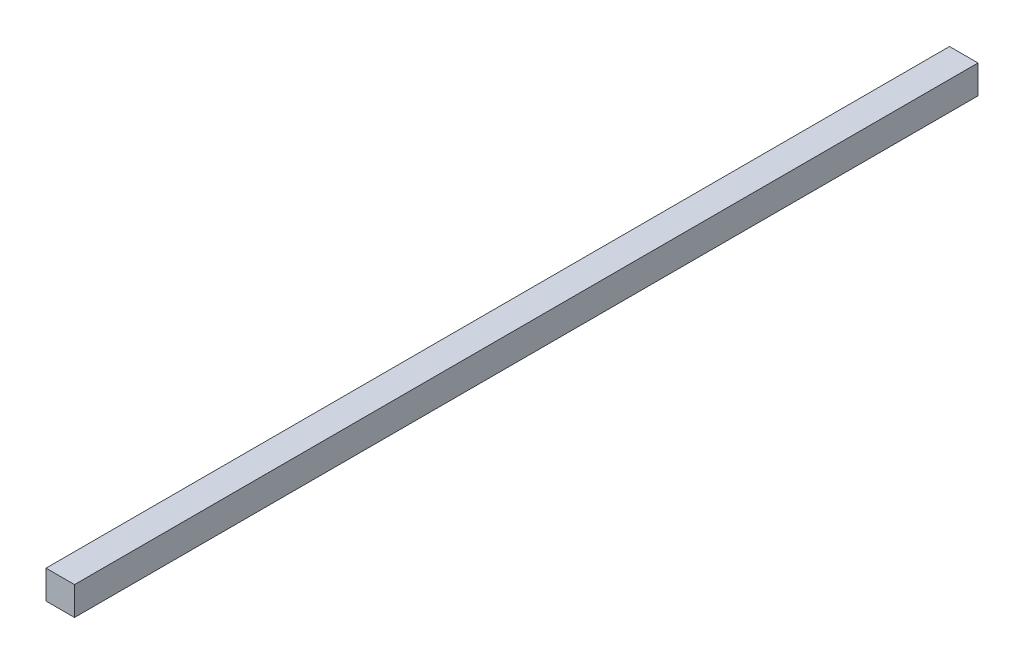
ISO-10303-21;
HEADER;
FILE_DESCRIPTION(('STEP AP214'),'2;1');
FILE_NAME('part.step','',(''),(''),'','','');
FILE_SCHEMA(('AUTOMOTIVE_DESIGN { 1 0 10303 214 1 1 1 1 }'));
ENDSEC;
DATA;
#1=APPLICATION_CONTEXT('core data for automotive mechanical design processes');
#2=APPLICATION_PROTOCOL_DEFINITION('international standard','automotive_design',2000,#1);
#3=PRODUCT_CONTEXT('',#1,'mechanical');
#4=PRODUCT('Part','Part','',(#3));
#5=PRODUCT_RELATED_PRODUCT_CATEGORY('part','',(#4));
#6=PRODUCT_DEFINITION_FORMATION('','',#4);
#7=PRODUCT_DEFINITION_CONTEXT('part definition',#1,'design');
#8=PRODUCT_DEFINITION('design','',#6,#7);
#9=PRODUCT_DEFINITION_SHAPE('','',#8);
#10=(LENGTH_UNIT() NAMED_UNIT(*) SI_UNIT(.MILLI.,.METRE.));
#11=(NAMED_UNIT(*) PLANE_ANGLE_UNIT() SI_UNIT($,.RADIAN.));
#12=(NAMED_UNIT(*) SI_UNIT($,.STERADIAN.) SOLID_ANGLE_UNIT());
#13=UNCERTAINTY_MEASURE_WITH_UNIT(LENGTH_MEASURE(1.E-05),#10,'distance_accuracy_value','');
#14=(GEOMETRIC_REPRESENTATION_CONTEXT(3) GLOBAL_UNCERTAINTY_ASSIGNED_CONTEXT((#13)) GLOBAL_UNIT_ASSIGNED_CONTEXT((#10,
#11,#12)) REPRESENTATION_CONTEXT('',''));
#15=CARTESIAN_POINT('',(0.,0.,0.));
#16=DIRECTION('',(0.,0.,1.));
#17=DIRECTION('',(1.,0.,0.));
#18=AXIS2_PLACEMENT_3D('',#15,#16,#17);
#19=CARTESIAN_POINT('',(182.063630383065,0.,-841.101024484277));
#20=DIRECTION('',(1.,0.,0.));
#21=DIRECTION('',(0.,0.,-1.));
#22=AXIS2_PLACEMENT_3D('',#19,#20,#21);
#23=PLANE('',#22);
#24=DIRECTION('',(0.,-1.,0.));
#25=VECTOR('',#24,1.);
#26=CARTESIAN_POINT('',(182.063630383065,0.,-805.18));
#27=LINE('',#26,#25);
#28=CARTESIAN_POINT('',(182.063630383065,0.,-805.18));
#29=VERTEX_POINT('',#28);
#30=CARTESIAN_POINT('',(182.063630383065,-25.4,-805.18));
#31=VERTEX_POINT('',#30);
#32=EDGE_CURVE('E39',#29,#31,#27,.T.);
#33=ORIENTED_EDGE('',*,*,#32,.F.);
#34=DIRECTION('',(0.,0.,1.));
#35=VECTOR('',#34,1.);
#36=CARTESIAN_POINT('',(182.063630383065,0.,-841.101024484277));
#37=LINE('',#36,#35);
#38=CARTESIAN_POINT('',(182.063630383065,0.,0.));
#39=VERTEX_POINT('',#38);
#40=EDGE_CURVE('E65',#29,#39,#37,.T.);
#41=ORIENTED_EDGE('',*,*,#40,.T.);
#42=DIRECTION('',(0.,1.,0.));
#43=VECTOR('',#42,1.);
#44=CARTESIAN_POINT('',(182.063630383065,0.,0.));
#45=LINE('',#44,#43);
#46=CARTESIAN_POINT('',(182.063630383065,-25.4,0.));
#47=VERTEX_POINT('',#46);
#48=EDGE_CURVE('E69',#47,#39,#45,.T.);
#49=ORIENTED_EDGE('',*,*,#48,.F.);
#50=DIRECTION('',(0.,0.,1.));
#51=VECTOR('',#50,1.);
#52=CARTESIAN_POINT('',(182.063630383065,-25.4,-841.101024484277));
#53=LINE('',#52,#51);
#54=EDGE_CURVE('E91',#31,#47,#53,.T.);
#55=ORIENTED_EDGE('',*,*,#54,.F.);
#56=EDGE_LOOP('',(#33,#41,#49,#55));
#57=FACE_BOUND('',#56,.T.);
#58=ADVANCED_FACE('F31',(#57),#23,.T.);
#59=CARTESIAN_POINT('',(182.063630383065,-25.4,-841.101024484277));
#60=DIRECTION('',(0.,-1.,0.));
#61=DIRECTION('',(1.,0.,0.));
#62=AXIS2_PLACEMENT_3D('',#59,#60,#61);
#63=PLANE('',#62);
#64=DIRECTION('',(-1.,0.,0.));
#65=VECTOR('',#64,1.);
#66=CARTESIAN_POINT('',(182.063630383065,-25.4,-805.18));
#67=LINE('',#66,#65);
#68=CARTESIAN_POINT('',(156.663630383065,-25.4,-805.18));
#69=VERTEX_POINT('',#68);
#70=EDGE_CURVE('E103',#31,#69,#67,.T.);
#71=ORIENTED_EDGE('',*,*,#70,.F.);
#72=ORIENTED_EDGE('',*,*,#54,.T.);
#73=DIRECTION('',(1.,0.,0.));
#74=VECTOR('',#73,1.);
#75=CARTESIAN_POINT('',(182.063630383065,-25.4,0.));
#76=LINE('',#75,#74);
#77=CARTESIAN_POINT('',(156.663630383065,-25.4,0.));
#78=VERTEX_POINT('',#77);
#79=EDGE_CURVE('E73',#78,#47,#76,.T.);
#80=ORIENTED_EDGE('',*,*,#79,.F.);
#81=DIRECTION('',(0.,0.,1.));
#82=VECTOR('',#81,1.);
#83=CARTESIAN_POINT('',(156.663630383065,-25.4,-841.101024484277));
#84=LINE('',#83,#82);
#85=EDGE_CURVE('E94',#69,#78,#84,.T.);
#86=ORIENTED_EDGE('',*,*,#85,.F.);
#87=EDGE_LOOP('',(#71,#72,#80,#86));
#88=FACE_BOUND('',#87,.T.);
#89=ADVANCED_FACE('F102',(#88),#63,.T.);
#90=CARTESIAN_POINT('',(156.663630383065,0.,-841.101024484277));
#91=DIRECTION('',(-1.,0.,0.));
#92=DIRECTION('',(0.,0.,1.));
#93=AXIS2_PLACEMENT_3D('',#90,#91,#92);
#94=PLANE('',#93);
#95=DIRECTION('',(0.,1.,0.));
#96=VECTOR('',#95,1.);
#97=CARTESIAN_POINT('',(156.663630383065,0.,-805.18));
#98=LINE('',#97,#96);
#99=CARTESIAN_POINT('',(156.663630383065,0.,-805.18));
#100=VERTEX_POINT('',#99);
#101=EDGE_CURVE('E93',#69,#100,#98,.T.);
#102=ORIENTED_EDGE('',*,*,#101,.F.);
#103=ORIENTED_EDGE('',*,*,#85,.T.);
#104=DIRECTION('',(0.,-1.,0.));
#105=VECTOR('',#104,1.);
#106=CARTESIAN_POINT('',(156.663630383065,0.,0.));
#107=LINE('',#106,#105);
#108=CARTESIAN_POINT('',(156.663630383065,0.,0.));
#109=VERTEX_POINT('',#108);
#110=EDGE_CURVE('E81',#109,#78,#107,.T.);
#111=ORIENTED_EDGE('',*,*,#110,.F.);
#112=DIRECTION('',(0.,0.,1.));
#113=VECTOR('',#112,1.);
#114=CARTESIAN_POINT('',(156.663630383065,0.,-841.101024484277));
#115=LINE('',#114,#113);
#116=EDGE_CURVE('E72',#100,#109,#115,.T.);
#117=ORIENTED_EDGE('',*,*,#116,.F.);
#118=EDGE_LOOP('',(#102,#103,#111,#117));
#119=FACE_BOUND('',#118,.T.);
#120=ADVANCED_FACE('F99',(#119),#94,.T.);
#121=CARTESIAN_POINT('',(182.063630383065,0.,-841.101024484277));
#122=DIRECTION('',(0.,1.,0.));
#123=DIRECTION('',(-1.,0.,0.));
#124=AXIS2_PLACEMENT_3D('',#121,#122,#123);
#125=PLANE('',#124);
#126=DIRECTION('',(1.,0.,0.));
#127=VECTOR('',#126,1.);
#128=CARTESIAN_POINT('',(182.063630383065,0.,-805.18));
#129=LINE('',#128,#127);
#130=EDGE_CURVE('E11',#100,#29,#129,.T.);
#131=ORIENTED_EDGE('',*,*,#130,.F.);
#132=ORIENTED_EDGE('',*,*,#116,.T.);
#133=DIRECTION('',(-1.,0.,0.));
#134=VECTOR('',#133,1.);
#135=CARTESIAN_POINT('',(182.063630383065,0.,0.));
#136=LINE('',#135,#134);
#137=EDGE_CURVE('E75',#39,#109,#136,.T.);
#138=ORIENTED_EDGE('',*,*,#137,.F.);
#139=ORIENTED_EDGE('',*,*,#40,.F.);
#140=EDGE_LOOP('',(#131,#132,#138,#139));
#141=FACE_BOUND('',#140,.T.);
#142=ADVANCED_FACE('F76',(#141),#125,.T.);
#143=CARTESIAN_POINT('',(182.063630383065,-25.4,0.));
#144=DIRECTION('',(0.,0.,-1.));
#145=DIRECTION('',(-1.,0.,0.));
#146=AXIS2_PLACEMENT_3D('',#143,#144,#145);
#147=PLANE('',#146);
#148=ORIENTED_EDGE('',*,*,#48,.T.);
#149=ORIENTED_EDGE('',*,*,#137,.T.);
#150=ORIENTED_EDGE('',*,*,#110,.T.);
#151=ORIENTED_EDGE('',*,*,#79,.T.);
#152=EDGE_LOOP('',(#148,#149,#150,#151));
#153=FACE_BOUND('',#152,.T.);
#154=ADVANCED_FACE('F83',(#153),#147,.F.);
#155=CARTESIAN_POINT('',(-872.04602997933,-800.100000000065,-805.18));
#156=DIRECTION('',(0.,0.,1.));
#157=DIRECTION('',(0.,-1.,0.));
#158=AXIS2_PLACEMENT_3D('',#155,#156,#157);
#159=PLANE('',#158);
#160=ORIENTED_EDGE('',*,*,#32,.T.);
#161=ORIENTED_EDGE('',*,*,#70,.T.);
#162=ORIENTED_EDGE('',*,*,#101,.T.);
#163=ORIENTED_EDGE('',*,*,#130,.T.);
#164=EDGE_LOOP('',(#160,#161,#162,#163));
#165=FACE_BOUND('',#164,.T.);
#166=ADVANCED_FACE('F104',(#165),#159,.F.);
#167=CLOSED_SHELL('',(#58,#89,#120,#142,#154,#166));
#168=MANIFOLD_SOLID_BREP('B2',#167);
#169=ADVANCED_BREP_SHAPE_REPRESENTATION('',(#18,#168),#14);
#170=SHAPE_DEFINITION_REPRESENTATION(#9,#169);
ENDSEC;
END-ISO-10303-21;
